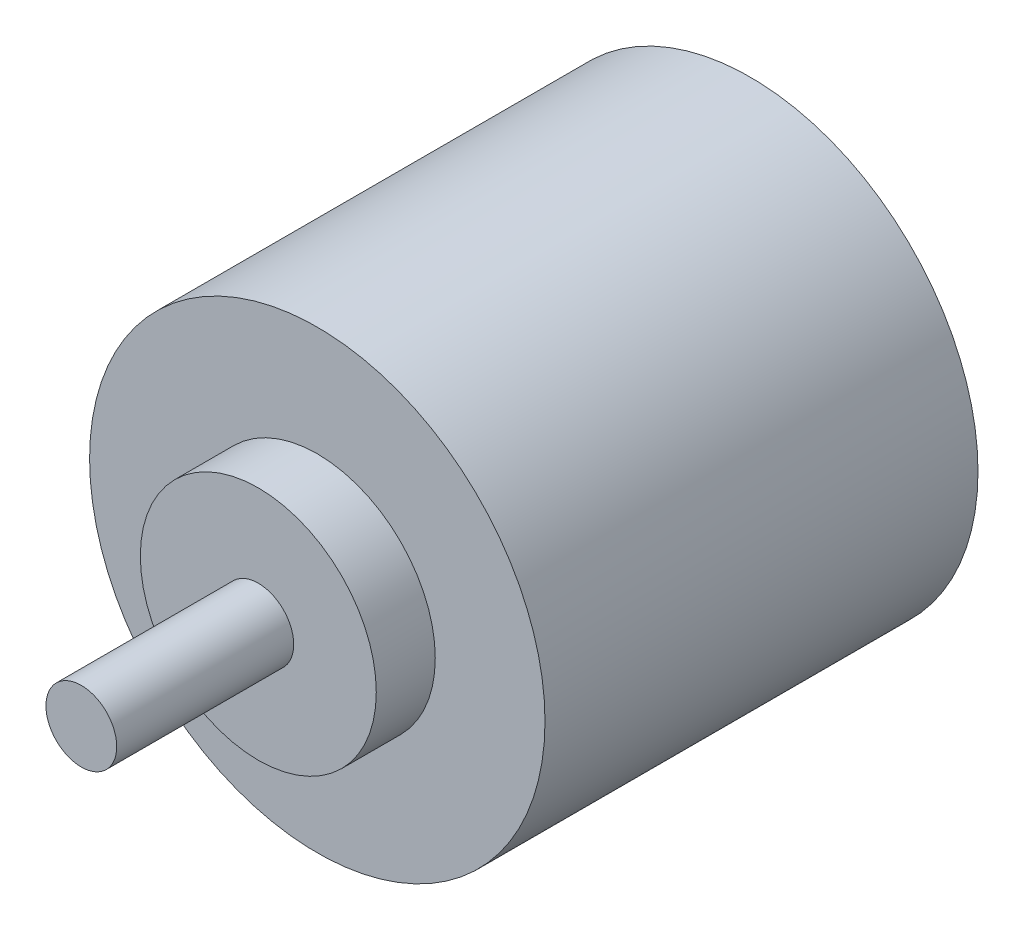
ISO-10303-21;
HEADER;
FILE_DESCRIPTION(('STEP AP214'),'2;1');
FILE_NAME('part.step','',(''),(''),'','','');
FILE_SCHEMA(('AUTOMOTIVE_DESIGN { 1 0 10303 214 1 1 1 1 }'));
ENDSEC;
DATA;
#1=APPLICATION_CONTEXT('core data for automotive mechanical design processes');
#2=APPLICATION_PROTOCOL_DEFINITION('international standard','automotive_design',2000,#1);
#3=PRODUCT_CONTEXT('',#1,'mechanical');
#4=PRODUCT('Part','Part','',(#3));
#5=PRODUCT_RELATED_PRODUCT_CATEGORY('part','',(#4));
#6=PRODUCT_DEFINITION_FORMATION('','',#4);
#7=PRODUCT_DEFINITION_CONTEXT('part definition',#1,'design');
#8=PRODUCT_DEFINITION('design','',#6,#7);
#9=PRODUCT_DEFINITION_SHAPE('','',#8);
#10=(LENGTH_UNIT() NAMED_UNIT(*) SI_UNIT(.MILLI.,.METRE.));
#11=(NAMED_UNIT(*) PLANE_ANGLE_UNIT() SI_UNIT($,.RADIAN.));
#12=(NAMED_UNIT(*) SI_UNIT($,.STERADIAN.) SOLID_ANGLE_UNIT());
#13=UNCERTAINTY_MEASURE_WITH_UNIT(LENGTH_MEASURE(1.E-05),#10,'distance_accuracy_value','');
#14=(GEOMETRIC_REPRESENTATION_CONTEXT(3) GLOBAL_UNCERTAINTY_ASSIGNED_CONTEXT((#13)) GLOBAL_UNIT_ASSIGNED_CONTEXT((#10,
#11,#12)) REPRESENTATION_CONTEXT('',''));
#15=CARTESIAN_POINT('',(0.,0.,0.));
#16=DIRECTION('',(0.,0.,1.));
#17=DIRECTION('',(1.,0.,0.));
#18=AXIS2_PLACEMENT_3D('',#15,#16,#17);
#19=CARTESIAN_POINT('',(-14.127422453689,5.37928778044314,36.7));
#20=DIRECTION('',(0.,0.,-1.));
#21=DIRECTION('',(-1.,0.,0.));
#22=AXIS2_PLACEMENT_3D('',#19,#20,#21);
#23=CYLINDRICAL_SURFACE('',#22,19.3);
#24=CARTESIAN_POINT('',(-14.127422453689,5.37928778044314,36.7));
#25=DIRECTION('',(0.,0.,1.));
#26=DIRECTION('',(1.,0.,0.));
#27=AXIS2_PLACEMENT_3D('',#24,#25,#26);
#28=CIRCLE('',#27,19.3);
#29=CARTESIAN_POINT('',(5.17257754631097,5.37928778044314,36.7));
#30=VERTEX_POINT('',#29);
#31=EDGE_CURVE('E43',#30,#30,#28,.T.);
#32=ORIENTED_EDGE('',*,*,#31,.F.);
#33=EDGE_LOOP('',(#32));
#34=FACE_BOUND('',#33,.T.);
#35=CARTESIAN_POINT('',(-14.127422453689,5.37928778044314,0.));
#36=DIRECTION('',(0.,0.,1.));
#37=DIRECTION('',(1.,0.,0.));
#38=AXIS2_PLACEMENT_3D('',#35,#36,#37);
#39=CIRCLE('',#38,19.3);
#40=CARTESIAN_POINT('',(5.17257754631097,5.37928778044314,0.));
#41=VERTEX_POINT('',#40);
#42=EDGE_CURVE('E34',#41,#41,#39,.T.);
#43=ORIENTED_EDGE('',*,*,#42,.T.);
#44=EDGE_LOOP('',(#43));
#45=FACE_BOUND('',#44,.T.);
#46=ADVANCED_FACE('F31',(#34,#45),#23,.T.);
#47=CARTESIAN_POINT('',(-14.127422453689,5.37928778044314,36.7));
#48=DIRECTION('',(0.,0.,1.));
#49=DIRECTION('',(1.,0.,0.));
#50=AXIS2_PLACEMENT_3D('',#47,#48,#49);
#51=PLANE('',#50);
#52=CARTESIAN_POINT('',(-14.127422453689,5.37928778044314,36.7));
#53=DIRECTION('',(0.,0.,1.));
#54=DIRECTION('',(1.,0.,0.));
#55=AXIS2_PLACEMENT_3D('',#52,#53,#54);
#56=CIRCLE('',#55,10.);
#57=CARTESIAN_POINT('',(-4.12742245368903,5.37928778044314,36.7));
#58=VERTEX_POINT('',#57);
#59=EDGE_CURVE('E38',#58,#58,#56,.T.);
#60=ORIENTED_EDGE('',*,*,#59,.F.);
#61=EDGE_LOOP('',(#60));
#62=FACE_BOUND('',#61,.T.);
#63=ORIENTED_EDGE('',*,*,#31,.T.);
#64=EDGE_LOOP('',(#63));
#65=FACE_BOUND('',#64,.T.);
#66=ADVANCED_FACE('F60',(#62,#65),#51,.T.);
#67=CARTESIAN_POINT('',(-14.127422453689,5.37928778044314,0.));
#68=DIRECTION('',(0.,0.,1.));
#69=DIRECTION('',(1.,0.,0.));
#70=AXIS2_PLACEMENT_3D('',#67,#68,#69);
#71=PLANE('',#70);
#72=ORIENTED_EDGE('',*,*,#42,.F.);
#73=EDGE_LOOP('',(#72));
#74=FACE_BOUND('',#73,.T.);
#75=ADVANCED_FACE('F57',(#74),#71,.F.);
#76=CARTESIAN_POINT('',(-14.127422453689,5.37928778044314,41.7));
#77=DIRECTION('',(0.,0.,-1.));
#78=DIRECTION('',(-1.,0.,0.));
#79=AXIS2_PLACEMENT_3D('',#76,#77,#78);
#80=CYLINDRICAL_SURFACE('',#79,10.);
#81=CARTESIAN_POINT('',(-14.127422453689,5.37928778044314,41.7));
#82=DIRECTION('',(0.,0.,1.));
#83=DIRECTION('',(1.,0.,0.));
#84=AXIS2_PLACEMENT_3D('',#81,#82,#83);
#85=CIRCLE('',#84,10.);
#86=CARTESIAN_POINT('',(-4.12742245368903,5.37928778044314,41.7));
#87=VERTEX_POINT('',#86);
#88=EDGE_CURVE('E48',#87,#87,#85,.T.);
#89=ORIENTED_EDGE('',*,*,#88,.F.);
#90=EDGE_LOOP('',(#89));
#91=FACE_BOUND('',#90,.T.);
#92=ORIENTED_EDGE('',*,*,#59,.T.);
#93=EDGE_LOOP('',(#92));
#94=FACE_BOUND('',#93,.T.);
#95=ADVANCED_FACE('F59',(#91,#94),#80,.T.);
#96=CARTESIAN_POINT('',(-14.127422453689,5.37928778044314,41.7));
#97=DIRECTION('',(0.,0.,1.));
#98=DIRECTION('',(1.,0.,0.));
#99=AXIS2_PLACEMENT_3D('',#96,#97,#98);
#100=PLANE('',#99);
#101=CARTESIAN_POINT('',(-14.127422453689,5.37928778044314,41.7));
#102=DIRECTION('',(0.,0.,1.));
#103=DIRECTION('',(1.,0.,0.));
#104=AXIS2_PLACEMENT_3D('',#101,#102,#103);
#105=CIRCLE('',#104,3.);
#106=CARTESIAN_POINT('',(-11.127422453689,5.37928778044314,41.7));
#107=VERTEX_POINT('',#106);
#108=EDGE_CURVE('E10',#107,#107,#105,.T.);
#109=ORIENTED_EDGE('',*,*,#108,.F.);
#110=EDGE_LOOP('',(#109));
#111=FACE_BOUND('',#110,.T.);
#112=ORIENTED_EDGE('',*,*,#88,.T.);
#113=EDGE_LOOP('',(#112));
#114=FACE_BOUND('',#113,.T.);
#115=ADVANCED_FACE('F65',(#111,#114),#100,.T.);
#116=CARTESIAN_POINT('',(-14.127422453689,5.37928778044314,56.7));
#117=DIRECTION('',(0.,0.,-1.));
#118=DIRECTION('',(-1.,0.,0.));
#119=AXIS2_PLACEMENT_3D('',#116,#117,#118);
#120=CYLINDRICAL_SURFACE('',#119,3.);
#121=CARTESIAN_POINT('',(-14.127422453689,5.37928778044314,56.7));
#122=DIRECTION('',(0.,0.,1.));
#123=DIRECTION('',(1.,0.,0.));
#124=AXIS2_PLACEMENT_3D('',#121,#122,#123);
#125=CIRCLE('',#124,3.);
#126=CARTESIAN_POINT('',(-11.127422453689,5.37928778044314,56.7));
#127=VERTEX_POINT('',#126);
#128=EDGE_CURVE('E47',#127,#127,#125,.T.);
#129=ORIENTED_EDGE('',*,*,#128,.F.);
#130=EDGE_LOOP('',(#129));
#131=FACE_BOUND('',#130,.T.);
#132=ORIENTED_EDGE('',*,*,#108,.T.);
#133=EDGE_LOOP('',(#132));
#134=FACE_BOUND('',#133,.T.);
#135=ADVANCED_FACE('F95',(#131,#134),#120,.T.);
#136=CARTESIAN_POINT('',(-14.127422453689,5.37928778044314,56.7));
#137=DIRECTION('',(0.,0.,1.));
#138=DIRECTION('',(1.,0.,0.));
#139=AXIS2_PLACEMENT_3D('',#136,#137,#138);
#140=PLANE('',#139);
#141=ORIENTED_EDGE('',*,*,#128,.T.);
#142=EDGE_LOOP('',(#141));
#143=FACE_BOUND('',#142,.T.);
#144=ADVANCED_FACE('F105',(#143),#140,.T.);
#145=CLOSED_SHELL('',(#46,#66,#75,#95,#115,#135,#144));
#146=MANIFOLD_SOLID_BREP('B2',#145);
#147=ADVANCED_BREP_SHAPE_REPRESENTATION('',(#18,#146),#14);
#148=SHAPE_DEFINITION_REPRESENTATION(#9,#147);
ENDSEC;
END-ISO-10303-21;
